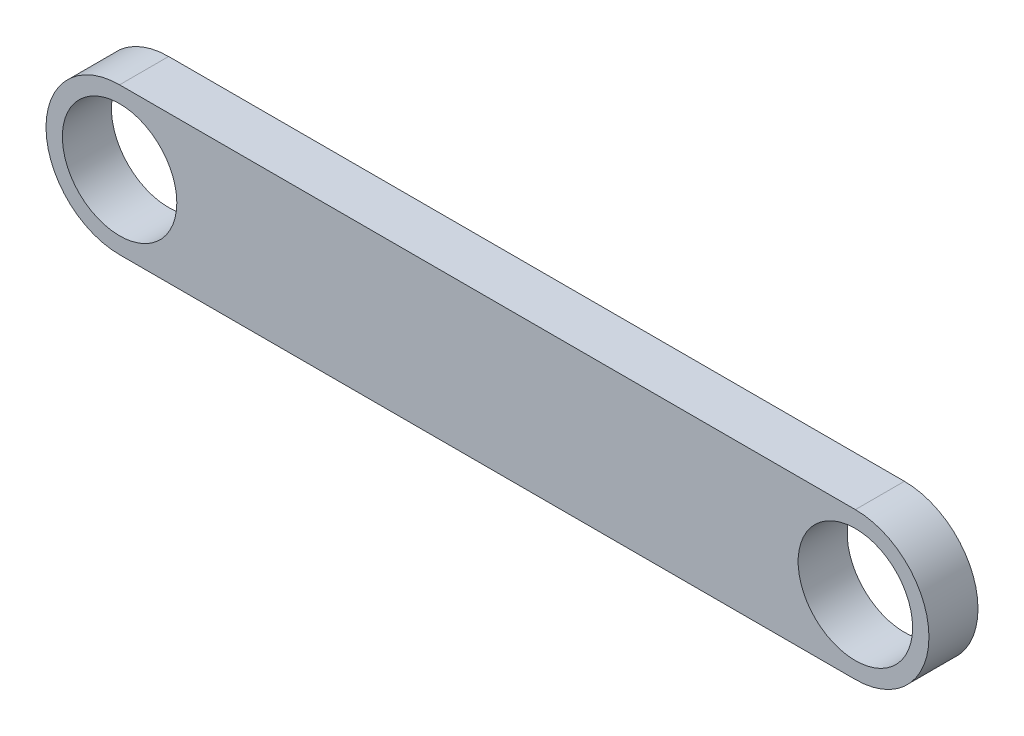
ISO-10303-21;
HEADER;
FILE_DESCRIPTION(('STEP AP214'),'2;1');
FILE_NAME('part.step','',(''),(''),'','','');
FILE_SCHEMA(('AUTOMOTIVE_DESIGN { 1 0 10303 214 1 1 1 1 }'));
ENDSEC;
DATA;
#1=APPLICATION_CONTEXT('core data for automotive mechanical design processes');
#2=APPLICATION_PROTOCOL_DEFINITION('international standard','automotive_design',2000,#1);
#3=PRODUCT_CONTEXT('',#1,'mechanical');
#4=PRODUCT('Part','Part','',(#3));
#5=PRODUCT_RELATED_PRODUCT_CATEGORY('part','',(#4));
#6=PRODUCT_DEFINITION_FORMATION('','',#4);
#7=PRODUCT_DEFINITION_CONTEXT('part definition',#1,'design');
#8=PRODUCT_DEFINITION('design','',#6,#7);
#9=PRODUCT_DEFINITION_SHAPE('','',#8);
#10=(LENGTH_UNIT() NAMED_UNIT(*) SI_UNIT(.MILLI.,.METRE.));
#11=(NAMED_UNIT(*) PLANE_ANGLE_UNIT() SI_UNIT($,.RADIAN.));
#12=(NAMED_UNIT(*) SI_UNIT($,.STERADIAN.) SOLID_ANGLE_UNIT());
#13=UNCERTAINTY_MEASURE_WITH_UNIT(LENGTH_MEASURE(1.E-05),#10,'distance_accuracy_value','');
#14=(GEOMETRIC_REPRESENTATION_CONTEXT(3) GLOBAL_UNCERTAINTY_ASSIGNED_CONTEXT((#13)) GLOBAL_UNIT_ASSIGNED_CONTEXT((#10,
#11,#12)) REPRESENTATION_CONTEXT('',''));
#15=CARTESIAN_POINT('',(0.,0.,0.));
#16=DIRECTION('',(0.,0.,1.));
#17=DIRECTION('',(1.,0.,0.));
#18=AXIS2_PLACEMENT_3D('',#15,#16,#17);
#19=CARTESIAN_POINT('',(0.,0.,1.5));
#20=DIRECTION('',(0.,0.,-1.));
#21=DIRECTION('',(-1.,0.,0.));
#22=AXIS2_PLACEMENT_3D('',#19,#20,#21);
#23=CYLINDRICAL_SURFACE('',#22,4.5);
#24=CARTESIAN_POINT('',(0.,0.,-1.5));
#25=DIRECTION('',(0.,0.,1.));
#26=DIRECTION('',(1.,0.,0.));
#27=AXIS2_PLACEMENT_3D('',#24,#25,#26);
#28=CIRCLE('',#27,4.5);
#29=CARTESIAN_POINT('',(0.,4.5,-1.5));
#30=VERTEX_POINT('',#29);
#31=CARTESIAN_POINT('',(0.,-4.5,-1.5));
#32=VERTEX_POINT('',#31);
#33=EDGE_CURVE('E115',#30,#32,#28,.T.);
#34=ORIENTED_EDGE('',*,*,#33,.T.);
#35=DIRECTION('',(0.,0.,-1.));
#36=VECTOR('',#35,1.);
#37=CARTESIAN_POINT('',(0.,-4.5,1.5));
#38=LINE('',#37,#36);
#39=CARTESIAN_POINT('',(0.,-4.5,1.5));
#40=VERTEX_POINT('',#39);
#41=EDGE_CURVE('E11',#40,#32,#38,.T.);
#42=ORIENTED_EDGE('',*,*,#41,.F.);
#43=CARTESIAN_POINT('',(0.,0.,1.5));
#44=DIRECTION('',(0.,0.,1.));
#45=DIRECTION('',(1.,0.,0.));
#46=AXIS2_PLACEMENT_3D('',#43,#44,#45);
#47=CIRCLE('',#46,4.5);
#48=CARTESIAN_POINT('',(0.,4.5,1.5));
#49=VERTEX_POINT('',#48);
#50=EDGE_CURVE('E95',#49,#40,#47,.T.);
#51=ORIENTED_EDGE('',*,*,#50,.F.);
#52=DIRECTION('',(0.,0.,-1.));
#53=VECTOR('',#52,1.);
#54=CARTESIAN_POINT('',(0.,4.5,1.5));
#55=LINE('',#54,#53);
#56=EDGE_CURVE('E61',#49,#30,#55,.T.);
#57=ORIENTED_EDGE('',*,*,#56,.T.);
#58=EDGE_LOOP('',(#34,#42,#51,#57));
#59=FACE_BOUND('',#58,.T.);
#60=ADVANCED_FACE('F44',(#59),#23,.T.);
#61=CARTESIAN_POINT('',(0.,-4.5,1.5));
#62=DIRECTION('',(0.,1.,0.));
#63=DIRECTION('',(-1.,0.,0.));
#64=AXIS2_PLACEMENT_3D('',#61,#62,#63);
#65=PLANE('',#64);
#66=DIRECTION('',(1.,0.,0.));
#67=VECTOR('',#66,1.);
#68=CARTESIAN_POINT('',(0.,-4.5,-1.5));
#69=LINE('',#68,#67);
#70=CARTESIAN_POINT('',(45.,-4.5,-1.5));
#71=VERTEX_POINT('',#70);
#72=EDGE_CURVE('E100',#32,#71,#69,.T.);
#73=ORIENTED_EDGE('',*,*,#72,.T.);
#74=DIRECTION('',(0.,0.,-1.));
#75=VECTOR('',#74,1.);
#76=CARTESIAN_POINT('',(45.,-4.5,1.5));
#77=LINE('',#76,#75);
#78=CARTESIAN_POINT('',(45.,-4.5,1.5));
#79=VERTEX_POINT('',#78);
#80=EDGE_CURVE('E53',#79,#71,#77,.T.);
#81=ORIENTED_EDGE('',*,*,#80,.F.);
#82=DIRECTION('',(1.,0.,0.));
#83=VECTOR('',#82,1.);
#84=CARTESIAN_POINT('',(0.,-4.5,1.5));
#85=LINE('',#84,#83);
#86=EDGE_CURVE('E87',#40,#79,#85,.T.);
#87=ORIENTED_EDGE('',*,*,#86,.F.);
#88=ORIENTED_EDGE('',*,*,#41,.T.);
#89=EDGE_LOOP('',(#73,#81,#87,#88));
#90=FACE_BOUND('',#89,.T.);
#91=ADVANCED_FACE('F99',(#90),#65,.F.);
#92=CARTESIAN_POINT('',(45.,0.,1.5));
#93=DIRECTION('',(0.,0.,-1.));
#94=DIRECTION('',(-1.,0.,0.));
#95=AXIS2_PLACEMENT_3D('',#92,#93,#94);
#96=CYLINDRICAL_SURFACE('',#95,4.5);
#97=CARTESIAN_POINT('',(45.,0.,-1.5));
#98=DIRECTION('',(0.,0.,1.));
#99=DIRECTION('',(1.,0.,0.));
#100=AXIS2_PLACEMENT_3D('',#97,#98,#99);
#101=CIRCLE('',#100,4.5);
#102=CARTESIAN_POINT('',(45.,4.5,-1.5));
#103=VERTEX_POINT('',#102);
#104=EDGE_CURVE('E118',#71,#103,#101,.T.);
#105=ORIENTED_EDGE('',*,*,#104,.T.);
#106=DIRECTION('',(0.,0.,-1.));
#107=VECTOR('',#106,1.);
#108=CARTESIAN_POINT('',(45.,4.5,1.5));
#109=LINE('',#108,#107);
#110=CARTESIAN_POINT('',(45.,4.5,1.5));
#111=VERTEX_POINT('',#110);
#112=EDGE_CURVE('E76',#111,#103,#109,.T.);
#113=ORIENTED_EDGE('',*,*,#112,.F.);
#114=CARTESIAN_POINT('',(45.,0.,1.5));
#115=DIRECTION('',(0.,0.,1.));
#116=DIRECTION('',(1.,0.,0.));
#117=AXIS2_PLACEMENT_3D('',#114,#115,#116);
#118=CIRCLE('',#117,4.5);
#119=EDGE_CURVE('E94',#79,#111,#118,.T.);
#120=ORIENTED_EDGE('',*,*,#119,.F.);
#121=ORIENTED_EDGE('',*,*,#80,.T.);
#122=EDGE_LOOP('',(#105,#113,#120,#121));
#123=FACE_BOUND('',#122,.T.);
#124=ADVANCED_FACE('F103',(#123),#96,.T.);
#125=CARTESIAN_POINT('',(0.,4.5,1.5));
#126=DIRECTION('',(0.,1.,0.));
#127=DIRECTION('',(0.,0.,1.));
#128=AXIS2_PLACEMENT_3D('',#125,#126,#127);
#129=PLANE('',#128);
#130=DIRECTION('',(1.,0.,0.));
#131=VECTOR('',#130,1.);
#132=CARTESIAN_POINT('',(0.,4.5,-1.5));
#133=LINE('',#132,#131);
#134=EDGE_CURVE('E120',#30,#103,#133,.T.);
#135=ORIENTED_EDGE('',*,*,#134,.F.);
#136=ORIENTED_EDGE('',*,*,#56,.F.);
#137=DIRECTION('',(1.,0.,0.));
#138=VECTOR('',#137,1.);
#139=CARTESIAN_POINT('',(0.,4.5,1.5));
#140=LINE('',#139,#138);
#141=EDGE_CURVE('E104',#49,#111,#140,.T.);
#142=ORIENTED_EDGE('',*,*,#141,.T.);
#143=ORIENTED_EDGE('',*,*,#112,.T.);
#144=EDGE_LOOP('',(#135,#136,#142,#143));
#145=FACE_BOUND('',#144,.T.);
#146=ADVANCED_FACE('F156',(#145),#129,.T.);
#147=CARTESIAN_POINT('',(0.,0.,1.5));
#148=DIRECTION('',(0.,0.,-1.));
#149=DIRECTION('',(-1.,0.,0.));
#150=AXIS2_PLACEMENT_3D('',#147,#148,#149);
#151=CYLINDRICAL_SURFACE('',#150,3.5);
#152=CARTESIAN_POINT('',(0.,0.,1.5));
#153=DIRECTION('',(0.,0.,1.));
#154=DIRECTION('',(1.,0.,0.));
#155=AXIS2_PLACEMENT_3D('',#152,#153,#154);
#156=CIRCLE('',#155,3.5);
#157=CARTESIAN_POINT('',(3.5,0.,1.5));
#158=VERTEX_POINT('',#157);
#159=EDGE_CURVE('E126',#158,#158,#156,.T.);
#160=ORIENTED_EDGE('',*,*,#159,.T.);
#161=EDGE_LOOP('',(#160));
#162=FACE_BOUND('',#161,.T.);
#163=CARTESIAN_POINT('',(0.,0.,-1.5));
#164=DIRECTION('',(0.,0.,1.));
#165=DIRECTION('',(1.,0.,0.));
#166=AXIS2_PLACEMENT_3D('',#163,#164,#165);
#167=CIRCLE('',#166,3.5);
#168=CARTESIAN_POINT('',(3.5,0.,-1.5));
#169=VERTEX_POINT('',#168);
#170=EDGE_CURVE('E112',#169,#169,#167,.T.);
#171=ORIENTED_EDGE('',*,*,#170,.F.);
#172=EDGE_LOOP('',(#171));
#173=FACE_BOUND('',#172,.T.);
#174=ADVANCED_FACE('F46',(#162,#173),#151,.F.);
#175=CARTESIAN_POINT('',(45.,0.,1.5));
#176=DIRECTION('',(0.,0.,-1.));
#177=DIRECTION('',(-1.,0.,0.));
#178=AXIS2_PLACEMENT_3D('',#175,#176,#177);
#179=CYLINDRICAL_SURFACE('',#178,3.49999999999999);
#180=CARTESIAN_POINT('',(45.,0.,1.5));
#181=DIRECTION('',(0.,0.,1.));
#182=DIRECTION('',(1.,0.,0.));
#183=AXIS2_PLACEMENT_3D('',#180,#181,#182);
#184=CIRCLE('',#183,3.49999999999999);
#185=CARTESIAN_POINT('',(48.5,0.,1.5));
#186=VERTEX_POINT('',#185);
#187=EDGE_CURVE('E106',#186,#186,#184,.T.);
#188=ORIENTED_EDGE('',*,*,#187,.T.);
#189=EDGE_LOOP('',(#188));
#190=FACE_BOUND('',#189,.T.);
#191=CARTESIAN_POINT('',(45.,0.,-1.5));
#192=DIRECTION('',(0.,0.,1.));
#193=DIRECTION('',(1.,0.,0.));
#194=AXIS2_PLACEMENT_3D('',#191,#192,#193);
#195=CIRCLE('',#194,3.49999999999999);
#196=CARTESIAN_POINT('',(48.5,0.,-1.5));
#197=VERTEX_POINT('',#196);
#198=EDGE_CURVE('E123',#197,#197,#195,.T.);
#199=ORIENTED_EDGE('',*,*,#198,.F.);
#200=EDGE_LOOP('',(#199));
#201=FACE_BOUND('',#200,.T.);
#202=ADVANCED_FACE('F138',(#190,#201),#179,.F.);
#203=CARTESIAN_POINT('',(0.,0.,1.5));
#204=DIRECTION('',(0.,0.,1.));
#205=DIRECTION('',(1.,0.,0.));
#206=AXIS2_PLACEMENT_3D('',#203,#204,#205);
#207=PLANE('',#206);
#208=ORIENTED_EDGE('',*,*,#159,.F.);
#209=EDGE_LOOP('',(#208));
#210=FACE_BOUND('',#209,.T.);
#211=ORIENTED_EDGE('',*,*,#50,.T.);
#212=ORIENTED_EDGE('',*,*,#86,.T.);
#213=ORIENTED_EDGE('',*,*,#119,.T.);
#214=ORIENTED_EDGE('',*,*,#141,.F.);
#215=EDGE_LOOP('',(#211,#212,#213,#214));
#216=FACE_BOUND('',#215,.T.);
#217=ORIENTED_EDGE('',*,*,#187,.F.);
#218=EDGE_LOOP('',(#217));
#219=FACE_BOUND('',#218,.T.);
#220=ADVANCED_FACE('F90',(#210,#216,#219),#207,.T.);
#221=CARTESIAN_POINT('',(0.,0.,-1.5));
#222=DIRECTION('',(0.,0.,1.));
#223=DIRECTION('',(1.,0.,0.));
#224=AXIS2_PLACEMENT_3D('',#221,#222,#223);
#225=PLANE('',#224);
#226=ORIENTED_EDGE('',*,*,#170,.T.);
#227=EDGE_LOOP('',(#226));
#228=FACE_BOUND('',#227,.T.);
#229=ORIENTED_EDGE('',*,*,#33,.F.);
#230=ORIENTED_EDGE('',*,*,#134,.T.);
#231=ORIENTED_EDGE('',*,*,#104,.F.);
#232=ORIENTED_EDGE('',*,*,#72,.F.);
#233=EDGE_LOOP('',(#229,#230,#231,#232));
#234=FACE_BOUND('',#233,.T.);
#235=ORIENTED_EDGE('',*,*,#198,.T.);
#236=EDGE_LOOP('',(#235));
#237=FACE_BOUND('',#236,.T.);
#238=ADVANCED_FACE('F137',(#228,#234,#237),#225,.F.);
#239=CLOSED_SHELL('',(#60,#91,#124,#146,#174,#202,#220,#238));
#240=MANIFOLD_SOLID_BREP('B2',#239);
#241=ADVANCED_BREP_SHAPE_REPRESENTATION('',(#18,#240),#14);
#242=SHAPE_DEFINITION_REPRESENTATION(#9,#241);
ENDSEC;
END-ISO-10303-21;
